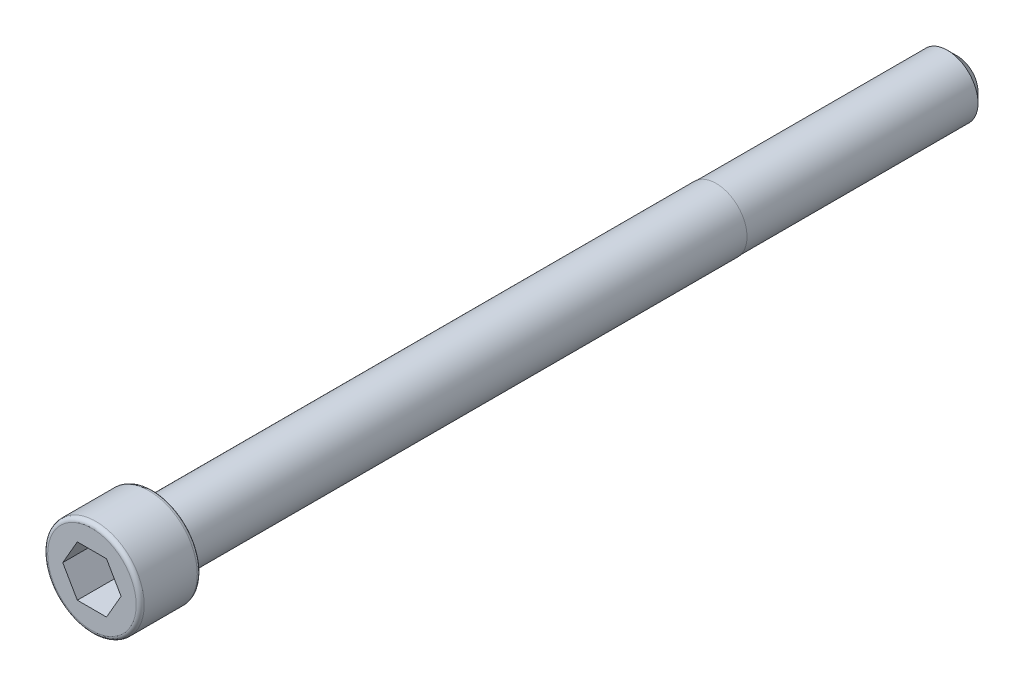
ISO-10303-21;
HEADER;
FILE_DESCRIPTION(('STEP AP214'),'2;1');
FILE_NAME('part.step','',(''),(''),'','','');
FILE_SCHEMA(('AUTOMOTIVE_DESIGN { 1 0 10303 214 1 1 1 1 }'));
ENDSEC;
DATA;
#1=APPLICATION_CONTEXT('core data for automotive mechanical design processes');
#2=APPLICATION_PROTOCOL_DEFINITION('international standard','automotive_design',2000,#1);
#3=PRODUCT_CONTEXT('',#1,'mechanical');
#4=PRODUCT('Part','Part','',(#3));
#5=PRODUCT_RELATED_PRODUCT_CATEGORY('part','',(#4));
#6=PRODUCT_DEFINITION_FORMATION('','',#4);
#7=PRODUCT_DEFINITION_CONTEXT('part definition',#1,'design');
#8=PRODUCT_DEFINITION('design','',#6,#7);
#9=PRODUCT_DEFINITION_SHAPE('','',#8);
#10=(LENGTH_UNIT() NAMED_UNIT(*) SI_UNIT(.MILLI.,.METRE.));
#11=(NAMED_UNIT(*) PLANE_ANGLE_UNIT() SI_UNIT($,.RADIAN.));
#12=(NAMED_UNIT(*) SI_UNIT($,.STERADIAN.) SOLID_ANGLE_UNIT());
#13=UNCERTAINTY_MEASURE_WITH_UNIT(LENGTH_MEASURE(1.E-05),#10,'distance_accuracy_value','');
#14=(GEOMETRIC_REPRESENTATION_CONTEXT(3) GLOBAL_UNCERTAINTY_ASSIGNED_CONTEXT((#13)) GLOBAL_UNIT_ASSIGNED_CONTEXT((#10,
#11,#12)) REPRESENTATION_CONTEXT('',''));
#15=CARTESIAN_POINT('',(0.,0.,0.));
#16=DIRECTION('',(0.,0.,1.));
#17=DIRECTION('',(1.,0.,0.));
#18=AXIS2_PLACEMENT_3D('',#15,#16,#17);
#19=CARTESIAN_POINT('',(0.,0.,1.016));
#20=DIRECTION('',(0.,0.,-1.));
#21=DIRECTION('',(-1.,0.,0.));
#22=AXIS2_PLACEMENT_3D('',#19,#20,#21);
#23=PLANE('',#22);
#24=DIRECTION('',(-0.50000000000019,0.866025403784329,0.));
#25=VECTOR('',#24,1.);
#26=CARTESIAN_POINT('',(1.15117870174,1.9939,1.01599999948));
#27=LINE('',#26,#25);
#28=CARTESIAN_POINT('',(2.30235740349704,-5.5337414309686E-11,1.01599999974));
#29=VERTEX_POINT('',#28);
#30=CARTESIAN_POINT('',(1.1511787015175,1.9939,1.01599999961));
#31=VERTEX_POINT('',#30);
#32=EDGE_CURVE('E85',#29,#31,#27,.T.);
#33=ORIENTED_EDGE('',*,*,#32,.T.);
#34=DIRECTION('',(-1.,0.,0.));
#35=VECTOR('',#34,1.);
#36=CARTESIAN_POINT('',(-1.15117870174,1.9939,1.01599999948));
#37=LINE('',#36,#35);
#38=CARTESIAN_POINT('',(-1.1511787017706,1.99389999994363,1.01599999974));
#39=VERTEX_POINT('',#38);
#40=EDGE_CURVE('E190',#31,#39,#37,.T.);
#41=ORIENTED_EDGE('',*,*,#40,.T.);
#42=DIRECTION('',(-0.50000000000019,-0.866025403784329,0.));
#43=VECTOR('',#42,1.);
#44=CARTESIAN_POINT('',(-2.30235740347,0.,1.01599999948));
#45=LINE('',#44,#43);
#46=CARTESIAN_POINT('',(-2.30235740347708,8.90044598723807E-12,1.01599999974));
#47=VERTEX_POINT('',#46);
#48=EDGE_CURVE('E195',#39,#47,#45,.T.);
#49=ORIENTED_EDGE('',*,*,#48,.T.);
#50=DIRECTION('',(0.50000000000019,-0.866025403784329,0.));
#51=VECTOR('',#50,1.);
#52=CARTESIAN_POINT('',(-1.15117870174,-1.9939,1.01599999948));
#53=LINE('',#52,#51);
#54=CARTESIAN_POINT('',(-1.1511787015175,-1.9939,1.01599999974));
#55=VERTEX_POINT('',#54);
#56=EDGE_CURVE('E199',#47,#55,#53,.T.);
#57=ORIENTED_EDGE('',*,*,#56,.T.);
#58=DIRECTION('',(1.,0.,0.));
#59=VECTOR('',#58,1.);
#60=CARTESIAN_POINT('',(1.15117870174,-1.9939,1.01599999948));
#61=LINE('',#60,#59);
#62=CARTESIAN_POINT('',(1.1511787017706,-1.99389999994363,1.01599999974));
#63=VERTEX_POINT('',#62);
#64=EDGE_CURVE('E81',#55,#63,#61,.T.);
#65=ORIENTED_EDGE('',*,*,#64,.T.);
#66=DIRECTION('',(0.50000000000019,0.866025403784329,0.));
#67=VECTOR('',#66,1.);
#68=CARTESIAN_POINT('',(2.30235740347,0.,1.01599999948));
#69=LINE('',#68,#67);
#70=EDGE_CURVE('E83',#63,#29,#69,.T.);
#71=ORIENTED_EDGE('',*,*,#70,.T.);
#72=EDGE_LOOP('',(#33,#41,#49,#57,#65,#71));
#73=FACE_BOUND('',#72,.T.);
#74=ADVANCED_FACE('F17',(#73),#23,.F.);
#75=CARTESIAN_POINT('',(1.15117870174,1.9939,4.826));
#76=DIRECTION('',(0.866025403784329,0.50000000000019,0.));
#77=DIRECTION('',(-0.50000000000019,0.866025403784329,0.));
#78=AXIS2_PLACEMENT_3D('',#75,#76,#77);
#79=PLANE('',#78);
#80=DIRECTION('',(0.,0.,1.));
#81=VECTOR('',#80,1.);
#82=CARTESIAN_POINT('',(1.15117870085,1.9939,4.826));
#83=LINE('',#82,#81);
#84=CARTESIAN_POINT('',(1.151178701295,1.9938999997975,4.826));
#85=VERTEX_POINT('',#84);
#86=EDGE_CURVE('E96',#85,#31,#83,.F.);
#87=ORIENTED_EDGE('',*,*,#86,.T.);
#88=ORIENTED_EDGE('',*,*,#32,.F.);
#89=DIRECTION('',(0.,0.,1.));
#90=VECTOR('',#89,1.);
#91=CARTESIAN_POINT('',(2.30235740344984,-3.49118533747311E-11,4.826));
#92=LINE('',#91,#90);
#93=CARTESIAN_POINT('',(2.30235740350163,-2.65298030653041E-11,4.826));
#94=VERTEX_POINT('',#93);
#95=EDGE_CURVE('E90',#29,#94,#92,.T.);
#96=ORIENTED_EDGE('',*,*,#95,.T.);
#97=DIRECTION('',(0.500000000469234,-0.866025403513526,0.));
#98=VECTOR('',#97,1.);
#99=CARTESIAN_POINT('',(1.15117870085,1.99389999919,4.826));
#100=LINE('',#99,#98);
#101=EDGE_CURVE('E189',#85,#94,#100,.T.);
#102=ORIENTED_EDGE('',*,*,#101,.F.);
#103=EDGE_LOOP('',(#87,#88,#96,#102));
#104=FACE_BOUND('',#103,.T.);
#105=ADVANCED_FACE('F93',(#104),#79,.F.);
#106=CARTESIAN_POINT('',(2.30235740347,0.,4.826));
#107=DIRECTION('',(0.866025403784329,-0.50000000000019,0.));
#108=DIRECTION('',(0.50000000000019,0.866025403784329,0.));
#109=AXIS2_PLACEMENT_3D('',#106,#107,#108);
#110=PLANE('',#109);
#111=ORIENTED_EDGE('',*,*,#95,.F.);
#112=ORIENTED_EDGE('',*,*,#70,.F.);
#113=DIRECTION('',(0.,0.,-1.));
#114=VECTOR('',#113,1.);
#115=CARTESIAN_POINT('',(1.15117870174,-1.9939,4.826));
#116=LINE('',#115,#114);
#117=CARTESIAN_POINT('',(1.1511787015787,-1.99389999968476,4.826));
#118=VERTEX_POINT('',#117);
#119=EDGE_CURVE('E104',#63,#118,#116,.F.);
#120=ORIENTED_EDGE('',*,*,#119,.T.);
#121=DIRECTION('',(-0.500000000469234,-0.866025403513526,0.));
#122=VECTOR('',#121,1.);
#123=CARTESIAN_POINT('',(2.30235740356,0.,4.826));
#124=LINE('',#123,#122);
#125=EDGE_CURVE('E101',#94,#118,#124,.T.);
#126=ORIENTED_EDGE('',*,*,#125,.F.);
#127=EDGE_LOOP('',(#111,#112,#120,#126));
#128=FACE_BOUND('',#127,.T.);
#129=ADVANCED_FACE('F99',(#128),#110,.F.);
#130=CARTESIAN_POINT('',(1.15117870174,-1.9939,4.826));
#131=DIRECTION('',(0.,-1.,0.));
#132=DIRECTION('',(0.,0.,-1.));
#133=AXIS2_PLACEMENT_3D('',#130,#131,#132);
#134=PLANE('',#133);
#135=ORIENTED_EDGE('',*,*,#119,.F.);
#136=ORIENTED_EDGE('',*,*,#64,.F.);
#137=DIRECTION('',(0.,0.,1.));
#138=VECTOR('',#137,1.);
#139=CARTESIAN_POINT('',(-1.15117870174,-1.9939,4.826));
#140=LINE('',#139,#138);
#141=CARTESIAN_POINT('',(-1.1511787010725,-1.9938999997975,4.826));
#142=VERTEX_POINT('',#141);
#143=EDGE_CURVE('E197',#55,#142,#140,.T.);
#144=ORIENTED_EDGE('',*,*,#143,.T.);
#145=DIRECTION('',(1.,0.,0.));
#146=VECTOR('',#145,1.);
#147=CARTESIAN_POINT('',(0.,-1.99389999919,4.826));
#148=LINE('',#147,#146);
#149=EDGE_CURVE('E203',#118,#142,#148,.F.);
#150=ORIENTED_EDGE('',*,*,#149,.F.);
#151=EDGE_LOOP('',(#135,#136,#144,#150));
#152=FACE_BOUND('',#151,.T.);
#153=ADVANCED_FACE('F204',(#152),#134,.F.);
#154=CARTESIAN_POINT('',(-1.15117870174,-1.9939,4.826));
#155=DIRECTION('',(-0.866025403784329,-0.50000000000019,0.));
#156=DIRECTION('',(0.50000000000019,-0.866025403784329,0.));
#157=AXIS2_PLACEMENT_3D('',#154,#155,#156);
#158=PLANE('',#157);
#159=ORIENTED_EDGE('',*,*,#143,.F.);
#160=ORIENTED_EDGE('',*,*,#56,.F.);
#161=DIRECTION('',(0.,0.,1.));
#162=VECTOR('',#161,1.);
#163=CARTESIAN_POINT('',(-2.30235740347,0.,4.826));
#164=LINE('',#163,#162);
#165=CARTESIAN_POINT('',(-2.30235740350667,1.78016505743743E-11,4.826));
#166=VERTEX_POINT('',#165);
#167=EDGE_CURVE('E193',#47,#166,#164,.T.);
#168=ORIENTED_EDGE('',*,*,#167,.T.);
#169=DIRECTION('',(-0.500000000469234,0.866025403513526,0.));
#170=VECTOR('',#169,1.);
#171=CARTESIAN_POINT('',(-1.15117870085,-1.99389999919,4.826));
#172=LINE('',#171,#170);
#173=EDGE_CURVE('E209',#142,#166,#172,.T.);
#174=ORIENTED_EDGE('',*,*,#173,.F.);
#175=EDGE_LOOP('',(#159,#160,#168,#174));
#176=FACE_BOUND('',#175,.T.);
#177=ADVANCED_FACE('F346',(#176),#158,.F.);
#178=CARTESIAN_POINT('',(-2.30235740347,0.,4.826));
#179=DIRECTION('',(-0.866025403784329,0.50000000000019,0.));
#180=DIRECTION('',(-0.50000000000019,-0.866025403784329,0.));
#181=AXIS2_PLACEMENT_3D('',#178,#179,#180);
#182=PLANE('',#181);
#183=ORIENTED_EDGE('',*,*,#167,.F.);
#184=ORIENTED_EDGE('',*,*,#48,.F.);
#185=DIRECTION('',(0.,0.,1.));
#186=VECTOR('',#185,1.);
#187=CARTESIAN_POINT('',(-1.15117870174,1.9939,4.826));
#188=LINE('',#187,#186);
#189=CARTESIAN_POINT('',(-1.1511787015787,1.99389999968476,4.826));
#190=VERTEX_POINT('',#189);
#191=EDGE_CURVE('E182',#39,#190,#188,.T.);
#192=ORIENTED_EDGE('',*,*,#191,.T.);
#193=DIRECTION('',(0.500000000469234,0.866025403513526,0.));
#194=VECTOR('',#193,1.);
#195=CARTESIAN_POINT('',(-2.30235740356,0.,4.826));
#196=LINE('',#195,#194);
#197=EDGE_CURVE('E217',#166,#190,#196,.T.);
#198=ORIENTED_EDGE('',*,*,#197,.F.);
#199=EDGE_LOOP('',(#183,#184,#192,#198));
#200=FACE_BOUND('',#199,.T.);
#201=ADVANCED_FACE('F337',(#200),#182,.F.);
#202=CARTESIAN_POINT('',(-1.15117870174,1.9939,4.826));
#203=DIRECTION('',(0.,1.,0.));
#204=DIRECTION('',(-1.,0.,0.));
#205=AXIS2_PLACEMENT_3D('',#202,#203,#204);
#206=PLANE('',#205);
#207=ORIENTED_EDGE('',*,*,#191,.F.);
#208=ORIENTED_EDGE('',*,*,#40,.F.);
#209=ORIENTED_EDGE('',*,*,#86,.F.);
#210=DIRECTION('',(1.,0.,0.));
#211=VECTOR('',#210,1.);
#212=CARTESIAN_POINT('',(0.,1.99389999919,4.826));
#213=LINE('',#212,#211);
#214=EDGE_CURVE('E219',#190,#85,#213,.T.);
#215=ORIENTED_EDGE('',*,*,#214,.F.);
#216=EDGE_LOOP('',(#207,#208,#209,#215));
#217=FACE_BOUND('',#216,.T.);
#218=ADVANCED_FACE('F329',(#217),#206,.F.);
#219=CARTESIAN_POINT('',(0.,0.,4.826));
#220=DIRECTION('',(0.,0.,1.));
#221=DIRECTION('',(1.,0.,0.));
#222=AXIS2_PLACEMENT_3D('',#219,#220,#221);
#223=PLANE('',#222);
#224=ORIENTED_EDGE('',*,*,#197,.T.);
#225=ORIENTED_EDGE('',*,*,#214,.T.);
#226=ORIENTED_EDGE('',*,*,#101,.T.);
#227=ORIENTED_EDGE('',*,*,#125,.T.);
#228=ORIENTED_EDGE('',*,*,#149,.T.);
#229=ORIENTED_EDGE('',*,*,#173,.T.);
#230=EDGE_LOOP('',(#224,#225,#226,#227,#228,#229));
#231=FACE_BOUND('',#230,.T.);
#232=CARTESIAN_POINT('',(-3.4925,0.,4.826));
#233=CARTESIAN_POINT('',(-3.49250095130771,0.0537844168487152,4.826));
#234=CARTESIAN_POINT('',(-3.49125761775951,0.107568757519057,4.826));
#235=CARTESIAN_POINT('',(-3.48628921123506,0.215022701121439,4.826));
#236=CARTESIAN_POINT('',(-3.48256413825881,0.268692304053478,4.826));
#237=CARTESIAN_POINT('',(-3.47263908316201,0.375802186797694,4.826));
#238=CARTESIAN_POINT('',(-3.46643910104147,0.429242466609871,4.826));
#239=CARTESIAN_POINT('',(-3.45157775862184,0.535779672729036,4.826));
#240=CARTESIAN_POINT('',(-3.44291639832274,0.588876599036024,4.826));
#241=CARTESIAN_POINT('',(-3.42315070296931,0.69461378291273,4.826));
#242=CARTESIAN_POINT('',(-3.41204636791497,0.747254040482449,4.826));
#243=CARTESIAN_POINT('',(-3.38741844179447,0.851965550919247,4.826));
#244=CARTESIAN_POINT('',(-3.3738948507283,0.904036803786325,4.826));
#245=CARTESIAN_POINT('',(-3.34445726683384,1.00749918186719,4.826));
#246=CARTESIAN_POINT('',(-3.32854327400555,1.05889030708097,4.826));
#247=CARTESIAN_POINT('',(-3.29435884941734,1.16088275869862,4.826));
#248=CARTESIAN_POINT('',(-3.27608841765743,1.21148408510249,4.826));
#249=CARTESIAN_POINT('',(-3.237230104732,1.31178895321478,4.826));
#250=CARTESIAN_POINT('',(-3.21664222356649,1.3614924949232,4.82599999999999));
#251=CARTESIAN_POINT('',(-3.17319294782234,1.45989572410699,4.82600000000001));
#252=CARTESIAN_POINT('',(-3.1503315532437,1.50859541158238,4.82600000000004));
#253=CARTESIAN_POINT('',(-3.10238403687142,1.60488700351675,4.82599999999996));
#254=CARTESIAN_POINT('',(-3.07729791507778,1.65247890797574,4.82599999999984));
#255=CARTESIAN_POINT('',(-3.02495448358711,1.74645337481376,4.82600000000016));
#256=CARTESIAN_POINT('',(-2.99769717389009,1.7928359371928,4.82600000000058));
#257=CARTESIAN_POINT('',(-2.94106951918126,1.88429272050554,4.82599999999942));
#258=CARTESIAN_POINT('',(-2.91169917416945,1.92936694143924,4.82599999999783));
#259=CARTESIAN_POINT('',(-2.85090818589969,2.01811091330256,4.82600000000217));
#260=CARTESIAN_POINT('',(-2.81948754264175,2.06178066423218,4.8260000000081));
#261=CARTESIAN_POINT('',(-2.75466278991072,2.14762227087693,4.8259999999919));
#262=CARTESIAN_POINT('',(-2.72125868043763,2.18979412659206,4.82599999996977));
#263=CARTESIAN_POINT('',(-2.65253910687777,2.27255081088689,4.82600000003023));
#264=CARTESIAN_POINT('',(-2.617223642791,2.3131356394666,4.82600000011282));
#265=CARTESIAN_POINT('',(-2.54475364399531,2.39262843140461,4.82599999988718));
#266=CARTESIAN_POINT('',(-2.50759910928639,2.43153639476292,4.82599999957894));
#267=CARTESIAN_POINT('',(-2.4299983688114,2.50914807795325,4.82600000043815));
#268=CARTESIAN_POINT('',(-2.38947976941706,2.54777942208324,4.82600000166598));
#269=CARTESIAN_POINT('',(-2.30665589072351,2.62307391083209,4.82599999262712));
#270=CARTESIAN_POINT('',(-2.26435068558777,2.65973713700595,4.8259999823609));
#271=CARTESIAN_POINT('',(-2.17804479538508,2.73100537621715,4.82599992632632));
#272=CARTESIAN_POINT('',(-2.13404413888851,2.76561042391229,4.82599988055856));
#273=CARTESIAN_POINT('',(-2.03325103864705,2.84108965556754,4.82599962925022));
#274=CARTESIAN_POINT('',(-1.97601020634548,2.88136888660954,4.82599938663408));
#275=CARTESIAN_POINT('',(-1.88257818325289,2.94298123108615,4.82599887847955));
#276=CARTESIAN_POINT('',(-1.84712757835364,2.96544708998243,4.82599866094539));
#277=CARTESIAN_POINT('',(-1.76346370566161,3.01630246828389,4.82599833968376));
#278=CARTESIAN_POINT('',(-1.71493253146231,3.04417253497762,4.82599829799941));
#279=CARTESIAN_POINT('',(-1.61655986320912,3.09745854598928,4.82599848329036));
#280=CARTESIAN_POINT('',(-1.56671866265542,3.12287503414733,4.82599871020599));
#281=CARTESIAN_POINT('',(-1.46586678690898,3.17124536640506,4.82599928365612));
#282=CARTESIAN_POINT('',(-1.41485645861883,3.19419992981153,4.82599963015555));
#283=CARTESIAN_POINT('',(-1.33749931250131,3.22658718151777,4.82599992786549));
#284=CARTESIAN_POINT('',(-1.31157578972567,3.2370412828093,4.82599999010016));
#285=CARTESIAN_POINT('',(-1.2772632041627,3.25055830679065,4.8260000031626));
#286=CARTESIAN_POINT('',(-1.26894731834262,3.25380956686738,4.82600000098418));
#287=CARTESIAN_POINT('',(-1.2146656238912,3.27480994601131,4.82599999038061));
#288=CARTESIAN_POINT('',(-1.16835778810388,3.29168915331098,4.82599999820428));
#289=CARTESIAN_POINT('',(-1.07241683674523,3.32436299899296,4.82599996617769));
#290=CARTESIAN_POINT('',(-1.02274413658395,3.34004174657353,4.82599992359705));
#291=CARTESIAN_POINT('',(-0.951289144795682,3.36085706533536,4.82599983637465));
#292=CARTESIAN_POINT('',(-0.929767519038414,3.36690366570283,4.82599980677656));
#293=CARTESIAN_POINT('',(-0.856866287607898,3.38662506258691,4.82599970323495));
#294=CARTESIAN_POINT('',(-0.805217483543486,3.39932725822745,4.82599962439687));
#295=CARTESIAN_POINT('',(-0.720379348505821,3.4181172668735,4.82599954001666));
#296=CARTESIAN_POINT('',(-0.687345918214095,3.42492532333591,4.82599951821437));
#297=CARTESIAN_POINT('',(-0.590840922785246,3.44334037191012,4.82599949222412));
#298=CARTESIAN_POINT('',(-0.527115672739877,3.45365363152359,4.82599952229308));
#299=CARTESIAN_POINT('',(-0.411992470266003,3.46899728561382,4.82599961456882));
#300=CARTESIAN_POINT('',(-0.360678327046342,3.47467174548045,4.82599966914441));
#301=CARTESIAN_POINT('',(-0.25784990878366,3.48372060622567,4.82599979023614));
#302=CARTESIAN_POINT('',(-0.206335650973799,3.48709520093009,4.82599985675127));
#303=CARTESIAN_POINT('',(-0.103213441422338,3.49152456415629,4.8259999605506));
#304=CARTESIAN_POINT('',(-0.0516054999186971,3.49257957249508,4.82599999783782));
#305=CARTESIAN_POINT('',(0.0516584692465476,3.49242034582949,4.8260000021644));
#306=CARTESIAN_POINT('',(0.103314491893357,3.4912037804988,4.82599996913162));
#307=CARTESIAN_POINT('',(0.206520575958427,3.48656206845455,4.82599992955414));
#308=CARTESIAN_POINT('',(0.258070652176523,3.48313725471453,4.82599992300544));
#309=CARTESIAN_POINT('',(0.360963284538255,3.47404150508104,4.82599998840567));
#310=CARTESIAN_POINT('',(0.412305859844803,3.46837078162007,4.82600006034719));
#311=CARTESIAN_POINT('',(0.52752154465549,3.45322803075311,4.82599992024647));
#312=CARTESIAN_POINT('',(0.591319714864386,3.44316019603631,4.82599963274455));
#313=CARTESIAN_POINT('',(0.673982986679909,3.42750042438782,4.8259994749533));
#314=CARTESIAN_POINT('',(0.693191005854818,3.42367585666563,4.8259994535447));
#315=CARTESIAN_POINT('',(0.769421263585956,3.40779501994053,4.82599943927506));
#316=CARTESIAN_POINT('',(0.826173978853371,3.39440464367302,4.82599958638948));
#317=CARTESIAN_POINT('',(0.912859131729578,3.37165561679765,4.8259997454351));
#318=CARTESIAN_POINT('',(0.943060260948491,3.3632952526321,4.82599978841998));
#319=CARTESIAN_POINT('',(1.01632006755366,3.34194773639414,4.8259998814082));
#320=CARTESIAN_POINT('',(1.05925454037887,3.32853040078232,4.82599992632526));
#321=CARTESIAN_POINT('',(1.14949236002663,3.29841093680456,4.82599998599283));
#322=CARTESIAN_POINT('',(1.19672903150414,3.28150845586508,4.82599999667072));
#323=CARTESIAN_POINT('',(1.25761380851147,3.25826277697965,4.82599999997576));
#324=CARTESIAN_POINT('',(1.27160947263458,3.25281773275548,4.82600000000801));
#325=CARTESIAN_POINT('',(1.31158681614839,3.23697692237502,4.82599999998507));
#326=CARTESIAN_POINT('',(1.33748353467184,3.22636594035495,4.8259999998303));
#327=CARTESIAN_POINT('',(1.41477977992539,3.19361237270242,4.82600000033892));
#328=CARTESIAN_POINT('',(1.46579162894157,3.17054686828672,4.82600000197498));
#329=CARTESIAN_POINT('',(1.56666006088445,3.12202579604722,4.82599998174152));
#330=CARTESIAN_POINT('',(1.61651669067601,3.09657032539184,4.82599995987296));
#331=CARTESIAN_POINT('',(1.71496405186119,3.04331576420105,4.82599985684906));
#332=CARTESIAN_POINT('',(1.7635547990828,3.01551670298719,4.82599977569446));
#333=CARTESIAN_POINT('',(1.84739066070905,2.96489255510572,4.82599945796473));
#334=CARTESIAN_POINT('',(1.8829356944891,2.94256106325786,4.82599926530915));
#335=CARTESIAN_POINT('',(1.9765914339524,2.88130343457128,4.82599872684066));
#336=CARTESIAN_POINT('',(2.03396174877461,2.84123207858725,4.82599836449067));
#337=CARTESIAN_POINT('',(2.13485451731467,2.76595757309878,4.82599820313271));
#338=CARTESIAN_POINT('',(2.17885060991409,2.73138501053438,4.82599830589885));
#339=CARTESIAN_POINT('',(2.26509575868037,2.66014070559059,4.82599875716389));
#340=CARTESIAN_POINT('',(2.30734528060094,2.62346952914442,4.82599910559682));
#341=CARTESIAN_POINT('',(2.38984528112677,2.54797712363782,4.82599969623092));
#342=CARTESIAN_POINT('',(2.43009643959074,2.50915663542951,4.82599993846845));
#343=CARTESIAN_POINT('',(2.49164876163638,2.44742934528695,4.82600003441541));
#344=CARTESIAN_POINT('',(2.51348396849335,2.42504871797396,4.82600001230034));
#345=CARTESIAN_POINT('',(2.56058421531572,2.37546588621157,4.82599998289972));
#346=CARTESIAN_POINT('',(2.58572565203965,2.34814574446068,4.82599997916758));
#347=CARTESIAN_POINT('',(2.64449509703361,2.28222299055783,4.8259999173366));
#348=CARTESIAN_POINT('',(2.67772913159731,2.24326776144292,4.82599983917353));
#349=CARTESIAN_POINT('',(2.72779810272376,2.18189078206844,4.82599967477469));
#350=CARTESIAN_POINT('',(2.74524667794025,2.15996680181388,4.82599960820816));
#351=CARTESIAN_POINT('',(2.77843919957838,2.11720233635289,4.82599947772255));
#352=CARTESIAN_POINT('',(2.79421848983115,2.09638923315041,4.82599941393018));
#353=CARTESIAN_POINT('',(2.84792623289834,2.02384729204241,4.82599921059709));
#354=CARTESIAN_POINT('',(2.88465797511551,1.97122111118459,4.8259990959785));
#355=CARTESIAN_POINT('',(2.94291571102955,1.882547611883,4.82599905139041));
#356=CARTESIAN_POINT('',(2.96530640225807,1.84706248207531,4.82599907126315));
#357=CARTESIAN_POINT('',(3.01602804174656,1.76334305045665,4.82599915506728));
#358=CARTESIAN_POINT('',(3.04385266706731,1.71480006205868,4.82599923147186));
#359=CARTESIAN_POINT('',(3.09710548595293,1.61642693998906,4.82599943008741));
#360=CARTESIAN_POINT('',(3.12253394870108,1.56659695170133,4.82599955229323));
#361=CARTESIAN_POINT('',(3.17094192420764,1.46576642977521,4.82599978249398));
#362=CARTESIAN_POINT('',(3.19392177518164,1.41476605898224,4.82599989049087));
#363=CARTESIAN_POINT('',(3.22650352904517,1.33747851648301,4.82599998158143));
#364=CARTESIAN_POINT('',(3.23704922161561,1.31158544464938,4.82600000012788));
#365=CARTESIAN_POINT('',(3.25674188929155,1.26153881815315,4.82599999988187));
#366=CARTESIAN_POINT('',(3.26593421054084,1.23740309266108,4.82599998382748));
#367=CARTESIAN_POINT('',(3.29273018731268,1.16471691686096,4.82599993247271));
#368=CARTESIAN_POINT('',(3.30955697638916,1.11587761105143,4.82599989397539));
#369=CARTESIAN_POINT('',(3.34110122715513,1.01753129605817,4.82599987682176));
#370=CARTESIAN_POINT('',(3.35581899244941,0.968024384104684,4.82599989815682));
#371=CARTESIAN_POINT('',(3.38308865041542,0.868422521415378,4.82600000843135));
#372=CARTESIAN_POINT('',(3.39564071308785,0.818327617165065,4.82600009736552));
#373=CARTESIAN_POINT('',(3.41580621871509,0.73024892608776,4.82599986721489));
#374=CARTESIAN_POINT('',(3.42386983017459,0.69236812221093,4.8259996445717));
#375=CARTESIAN_POINT('',(3.43938685080312,0.611838284311693,4.82599945164043));
#376=CARTESIAN_POINT('',(3.44665620973309,0.569153667627369,4.82599951420228));
#377=CARTESIAN_POINT('',(3.46299496757132,0.461165249861801,4.82599967770579));
#378=CARTESIAN_POINT('',(3.4710186367182,0.395702428596684,4.82599978161336));
#379=CARTESIAN_POINT('',(3.48390863994499,0.25824706050607,4.82599993386127));
#380=CARTESIAN_POINT('',(3.4884069401995,0.186219579171003,4.82599997605458));
#381=CARTESIAN_POINT('',(3.49191298711629,0.0760962877146059,4.82600000171917));
#382=CARTESIAN_POINT('',(3.49251065978642,0.0380459559738478,4.82600000351537));
#383=CARTESIAN_POINT('',(3.4925,0.,4.826));
#384=B_SPLINE_CURVE_WITH_KNOTS('',3,(#232,#233,#234,#235,#236,#237,#238,#239,#240,#241,#242,
#243,#244,#245,#246,#247,#248,#249,#250,#251,#252,#253,#254,#255,#256,#257,#258,#259,#260,#261,
#262,#263,#264,#265,#266,#267,#268,#269,#270,#271,#272,#273,#274,#275,#276,#277,#278,#279,#280,
#281,#282,#283,#284,#285,#286,#287,#288,#289,#290,#291,#292,#293,#294,#295,#296,#297,#298,#299,
#300,#301,#302,#303,#304,#305,#306,#307,#308,#309,#310,#311,#312,#313,#314,#315,#316,#317,#318,
#319,#320,#321,#322,#323,#324,#325,#326,#327,#328,#329,#330,#331,#332,#333,#334,#335,#336,#337,
#338,#339,#340,#341,#342,#343,#344,#345,#346,#347,#348,#349,#350,#351,#352,#353,#354,#355,#356,
#357,#358,#359,#360,#361,#362,#363,#364,#365,#366,#367,#368,#369,#370,#371,#372,#373,#374,#375,
#376,#377,#378,#379,#380,#381,#382,#383),.UNSPECIFIED.,.F.,.F.,(4,2,2,2,2,2,2,2,2,2,2,2,2,2,2,2,
2,2,2,2,2,2,2,2,2,2,2,2,2,2,2,2,2,2,2,2,2,2,2,2,2,2,2,2,2,2,2,2,2,2,2,2,2,2,2,2,2,2,2,2,2,2,2,2,
2,2,2,2,2,2,2,2,2,2,2,4),(0.,0.161338773196214,0.322677546392428,0.484016319588641,
0.645355092784855,0.806693865981066,0.968032639177283,1.12937141237349,1.2907101855697,
1.45204895876591,1.61338773196213,1.77472650515834,1.93606527835455,2.09740405155076,
2.25874282474698,2.42008159794319,2.5814203711394,2.74275914433562,2.91064582905079,
3.07852555148779,3.2464024461871,3.45623976108323,3.58212596054041,3.74994361335377,
3.91772398325986,4.08545519803693,4.16930509495521,4.19609180361308,4.34391069810973,
4.50011737746179,4.56718016633308,4.72667375031603,4.82784713502767,5.02139415195395,
5.1762279614621,5.33104872042004,5.48585347204145,5.64081711958778,5.79575740620599,
5.9506830410802,6.14432430244255,6.20307816119164,6.37791614863079,6.47191931601119,
6.60683087432195,6.75728875018523,6.80234079591049,6.88629257089911,7.0541762141514,
7.22205303474194,7.3899277552734,7.51584043337318,7.72562576591714,7.89342821579159,
8.06118562568246,8.2288855665257,8.32268236815574,8.43404738495866,8.58760966087114,
8.67166169774053,8.75001225213626,8.942424111921,9.06827816233932,9.2360633051767,
9.40382957661751,9.57157264514684,9.65544030801214,9.73291597011632,9.8878352726082,
10.0427322512188,10.1976170653763,10.3137827020191,10.4436451868486,10.6413982260157,
10.8577547641024,10.9718980038413),.UNSPECIFIED.);
#385=CARTESIAN_POINT('',(-3.4925,0.,4.826));
#386=VERTEX_POINT('',#385);
#387=CARTESIAN_POINT('',(3.4925,0.,4.826));
#388=VERTEX_POINT('',#387);
#389=EDGE_CURVE('E221',#386,#388,#384,.T.);
#390=ORIENTED_EDGE('',*,*,#389,.F.);
#391=CARTESIAN_POINT('',(0.,0.,4.826));
#392=DIRECTION('',(0.,0.,-1.));
#393=DIRECTION('',(1.,0.,0.));
#394=AXIS2_PLACEMENT_3D('',#391,#392,#393);
#395=CIRCLE('',#394,3.4925);
#396=EDGE_CURVE('E120',#388,#386,#395,.T.);
#397=ORIENTED_EDGE('',*,*,#396,.F.);
#398=EDGE_LOOP('',(#390,#397));
#399=FACE_BOUND('',#398,.T.);
#400=ADVANCED_FACE('F170',(#231,#399),#223,.T.);
#401=CARTESIAN_POINT('',(0.,0.,4.5085));
#402=DIRECTION('',(0.,0.,1.));
#403=DIRECTION('',(-1.,0.,0.));
#404=AXIS2_PLACEMENT_3D('',#401,#402,#403);
#405=TOROIDAL_SURFACE('',#404,3.4925,0.3175);
#406=ORIENTED_EDGE('',*,*,#389,.T.);
#407=ORIENTED_EDGE('',*,*,#396,.T.);
#408=EDGE_LOOP('',(#406,#407));
#409=FACE_BOUND('',#408,.T.);
#410=CARTESIAN_POINT('',(0.,0.,4.5085));
#411=DIRECTION('',(0.,0.,1.));
#412=DIRECTION('',(1.,0.,0.));
#413=AXIS2_PLACEMENT_3D('',#410,#411,#412);
#414=CIRCLE('',#413,3.81);
#415=CARTESIAN_POINT('',(3.81,0.,4.5085));
#416=VERTEX_POINT('',#415);
#417=EDGE_CURVE('E118',#416,#416,#414,.F.);
#418=ORIENTED_EDGE('',*,*,#417,.F.);
#419=EDGE_LOOP('',(#418));
#420=FACE_BOUND('',#419,.T.);
#421=ADVANCED_FACE('F164',(#409,#420),#405,.T.);
#422=CARTESIAN_POINT('',(0.,0.,-63.5));
#423=DIRECTION('',(0.,0.,1.));
#424=DIRECTION('',(1.,0.,0.));
#425=AXIS2_PLACEMENT_3D('',#422,#423,#424);
#426=PLANE('',#425);
#427=CARTESIAN_POINT('',(0.,0.,-63.4999999999764));
#428=DIRECTION('',(0.,0.,1.));
#429=DIRECTION('',(1.,0.,0.));
#430=AXIS2_PLACEMENT_3D('',#427,#428,#429);
#431=CIRCLE('',#430,1.61925000003293);
#432=CARTESIAN_POINT('',(1.61925000003293,0.,-63.4999999999764));
#433=VERTEX_POINT('',#432);
#434=EDGE_CURVE('E114',#433,#433,#431,.T.);
#435=ORIENTED_EDGE('',*,*,#434,.F.);
#436=EDGE_LOOP('',(#435));
#437=FACE_BOUND('',#436,.T.);
#438=ADVANCED_FACE('F169',(#437),#426,.F.);
#439=CARTESIAN_POINT('',(0.,0.,0.));
#440=DIRECTION('',(0.,0.,1.));
#441=DIRECTION('',(1.,0.,0.));
#442=AXIS2_PLACEMENT_3D('',#439,#440,#441);
#443=CYLINDRICAL_SURFACE('',#442,3.81);
#444=CARTESIAN_POINT('',(0.,0.,0.3175));
#445=DIRECTION('',(0.,0.,-1.));
#446=DIRECTION('',(1.,0.,0.));
#447=AXIS2_PLACEMENT_3D('',#444,#445,#446);
#448=CIRCLE('',#447,3.81);
#449=CARTESIAN_POINT('',(3.81,0.,0.3175));
#450=VERTEX_POINT('',#449);
#451=EDGE_CURVE('E117',#450,#450,#448,.T.);
#452=ORIENTED_EDGE('',*,*,#451,.F.);
#453=EDGE_LOOP('',(#452));
#454=FACE_BOUND('',#453,.T.);
#455=ORIENTED_EDGE('',*,*,#417,.T.);
#456=EDGE_LOOP('',(#455));
#457=FACE_BOUND('',#456,.T.);
#458=ADVANCED_FACE('F241',(#454,#457),#443,.T.);
#459=CARTESIAN_POINT('',(0.,0.,-62.7062500000193));
#460=DIRECTION('',(0.,0.,1.));
#461=DIRECTION('',(1.,0.,0.));
#462=AXIS2_PLACEMENT_3D('',#459,#460,#461);
#463=CONICAL_SURFACE('',#462,2.41299999999001,0.785398163397448);
#464=ORIENTED_EDGE('',*,*,#434,.T.);
#465=EDGE_LOOP('',(#464));
#466=FACE_BOUND('',#465,.T.);
#467=CARTESIAN_POINT('',(0.,0.,-62.70625));
#468=DIRECTION('',(0.,0.,-1.));
#469=DIRECTION('',(-1.,0.,0.));
#470=AXIS2_PLACEMENT_3D('',#467,#468,#469);
#471=CIRCLE('',#470,2.413);
#472=CARTESIAN_POINT('',(-2.413,0.,-62.70625));
#473=VERTEX_POINT('',#472);
#474=EDGE_CURVE('E151',#473,#473,#471,.F.);
#475=ORIENTED_EDGE('',*,*,#474,.F.);
#476=EDGE_LOOP('',(#475));
#477=FACE_BOUND('',#476,.T.);
#478=ADVANCED_FACE('F137',(#466,#477),#463,.T.);
#479=CARTESIAN_POINT('',(0.,0.,0.3175));
#480=DIRECTION('',(0.,0.,-1.));
#481=DIRECTION('',(1.,0.,0.));
#482=AXIS2_PLACEMENT_3D('',#479,#480,#481);
#483=TOROIDAL_SURFACE('',#482,3.4925,0.3175);
#484=CARTESIAN_POINT('',(3.4925,0.,0.));
#485=CARTESIAN_POINT('',(3.49250103075493,0.0548554386916498,-2.09812721195199E-13));
#486=CARTESIAN_POINT('',(3.49120764772346,0.109710792244904,-1.04906360597541E-13));
#487=CARTESIAN_POINT('',(3.48603944896599,0.219299772455741,1.04906360597425E-13));
#488=CARTESIAN_POINT('',(3.48216463323997,0.274033399113323,2.09812721194734E-13));
#489=CARTESIAN_POINT('',(3.47184096397162,0.38325736891393,-2.0981272119427E-13));
#490=CARTESIAN_POINT('',(3.46539211042928,0.437747712056957,-7.34344524179189E-13));
#491=CARTESIAN_POINT('',(3.44993498429349,0.546364157857678,7.34344524176749E-13));
#492=CARTESIAN_POINT('',(3.44092671170005,0.600490260515374,2.72756537550924E-12));
#493=CARTESIAN_POINT('',(3.4203707388517,0.708258108800809,-2.72756537549717E-12));
#494=CARTESIAN_POINT('',(3.4088230385968,0.761899854428551,-1.01759169777943E-11));
#495=CARTESIAN_POINT('',(3.38321356500163,0.868579760294865,1.01759169777379E-11));
#496=CARTESIAN_POINT('',(3.36915179166137,0.921617920533441,3.79761025353721E-11));
#497=CARTESIAN_POINT('',(3.33854651242355,1.02697348338672,-3.79761025351197E-11));
#498=CARTESIAN_POINT('',(3.32200300652601,1.07929088600142,-1.41728493162371E-10));
#499=CARTESIAN_POINT('',(3.28646676572368,1.18308668341869,1.41728493161274E-10));
#500=CARTESIAN_POINT('',(3.26747403081892,1.23456507822127,5.28937870108367E-10));
#501=CARTESIAN_POINT('',(3.22541745396728,1.34082045482438,-5.72948748511526E-10));
#502=CARTESIAN_POINT('',(3.2021463625928,1.39551550091629,-2.22084562319813E-09));
#503=CARTESIAN_POINT('',(3.15287878853342,1.50366075549216,9.49381791557917E-09));
#504=CARTESIAN_POINT('',(3.12688242180297,1.55711101682079,2.28557399291724E-08));
#505=CARTESIAN_POINT('',(3.07222056347815,1.66262777855654,9.35158103919374E-08));
#506=CARTESIAN_POINT('',(3.04355511120479,1.71469429933443,1.50813311671165E-07));
#507=CARTESIAN_POINT('',(2.98364649559711,1.81732359491237,4.38322660083501E-07));
#508=CARTESIAN_POINT('',(2.95240329858408,1.86788635005371,6.68536766721361E-07));
#509=CARTESIAN_POINT('',(2.88731266508974,1.96740101426567,1.19374841235256E-06));
#510=CARTESIAN_POINT('',(2.85346199900374,2.01635081486648,1.48882715869826E-06));
#511=CARTESIAN_POINT('',(2.78321214803887,2.11237051076023,1.72107549948544E-06));
#512=CARTESIAN_POINT('',(2.74681343356572,2.15944075054002,1.65831098563617E-06));
#513=CARTESIAN_POINT('',(2.67163607112966,2.25162499157862,1.25411535370921E-06));
#514=CARTESIAN_POINT('',(2.63285805436322,2.29673950629133,9.1275784948221E-07));
#515=CARTESIAN_POINT('',(2.55286110507995,2.38471426950349,3.18021853745481E-07));
#516=CARTESIAN_POINT('',(2.51164301724777,2.42757528851098,6.46131228867418E-08));
#517=CARTESIAN_POINT('',(2.44394080492616,2.49515288699991,-3.93607941022556E-08));
#518=CARTESIAN_POINT('',(2.4179940765682,2.52041401840283,-8.66029867831067E-09));
#519=CARTESIAN_POINT('',(2.36102417534515,2.57412633214442,4.82657407062441E-08));
#520=CARTESIAN_POINT('',(2.32986081596326,2.6024294745211,7.29552303127642E-08));
#521=CARTESIAN_POINT('',(2.25451194153974,2.66844420238837,1.91889056723857E-07));
#522=CARTESIAN_POINT('',(2.20987699968704,2.70564515393594,3.08994323382234E-07));
#523=CARTESIAN_POINT('',(2.14313816343163,2.75848553184766,5.12363674342908E-07));
#524=CARTESIAN_POINT('',(2.12174036496883,2.77502368788578,5.81667128580306E-07));
#525=CARTESIAN_POINT('',(2.07919461111888,2.80711077881713,7.04231723975026E-07));
#526=CARTESIAN_POINT('',(2.05805780756925,2.82267450192175,7.57904627636369E-07));
#527=CARTESIAN_POINT('',(1.99605832778206,2.8672407237802,8.8753592984081E-07));
#528=CARTESIAN_POINT('',(1.95472916081823,2.89559954679039,9.39405405238572E-07));
#529=CARTESIAN_POINT('',(1.88632380091935,2.94035339969148,9.19698387625334E-07));
#530=CARTESIAN_POINT('',(1.85960913091512,2.95730531688262,8.86576478827475E-07));
#531=CARTESIAN_POINT('',(1.797101354671,2.99577634463936,7.89758794509634E-07));
#532=CARTESIAN_POINT('',(1.76113866808308,3.01702113008824,7.19671138718183E-07));
#533=CARTESIAN_POINT('',(1.68847866036188,3.05820925357641,5.95879160836578E-07));
#534=CARTESIAN_POINT('',(1.65178135844715,3.07815262560448,5.42174410742365E-07));
#535=CARTESIAN_POINT('',(1.56287832492531,3.12441990635484,4.19388844197404E-07));
#536=CARTESIAN_POINT('',(1.51033917078923,3.15010620949775,3.52747136023275E-07));
#537=CARTESIAN_POINT('',(1.40403880893236,3.19880768732667,2.36102506013171E-07));
#538=CARTESIAN_POINT('',(1.35027764804138,3.22182296416619,1.86098947713861E-07));
#539=CARTESIAN_POINT('',(1.26494643959612,3.25584488022635,1.20813628602225E-07));
#540=CARTESIAN_POINT('',(1.23373986665508,3.2677709594701,9.9835238085077E-08));
#541=CARTESIAN_POINT('',(1.17099679363046,3.29072145371812,6.31551609781029E-08));
#542=CARTESIAN_POINT('',(1.13946030106618,3.30174588922178,4.74533543968587E-08));
#543=CARTESIAN_POINT('',(1.0780683630411,3.32222821426819,2.49734234976062E-08));
#544=CARTESIAN_POINT('',(1.04823116837516,3.33174095926145,1.76985141514646E-08));
#545=CARTESIAN_POINT('',(0.977912907439797,3.35313045473455,5.93085087732378E-09));
#546=CARTESIAN_POINT('',(0.937332332767593,3.36468156937523,3.28044057419767E-09));
#547=CARTESIAN_POINT('',(0.849897804705737,3.38787218695534,7.97689071999967E-11));
#548=CARTESIAN_POINT('',(0.8029834035227,3.39928403347575,-1.12351814785254E-10));
#549=CARTESIAN_POINT('',(0.702780246115235,3.42147508310594,2.43993847320562E-10));
#550=CARTESIAN_POINT('',(0.649433526363574,3.43199314621677,8.88881076769856E-10));
#551=CARTESIAN_POINT('',(0.536310196737131,3.45157085839791,1.82824961820272E-09));
#552=CARTESIAN_POINT('',(0.476482364798151,3.46033540321774,2.07541892809898E-09));
#553=CARTESIAN_POINT('',(0.350409845881685,3.4754782172931,1.96495096700549E-09));
#554=CARTESIAN_POINT('',(0.284125549393371,3.48152739714214,1.54391670913986E-09));
#555=CARTESIAN_POINT('',(0.145241440006662,3.49021435389499,5.6534597914781E-10));
#556=CARTESIAN_POINT('',(0.0726185238759296,3.49248948380003,-1.15357763984597E-12));
#557=CARTESIAN_POINT('',(-0.0571477966275232,3.4925082752815,9.07818237514806E-13));
#558=CARTESIAN_POINT('',(-0.114292873112433,3.4911140655033,3.53365705774095E-10));
#559=CARTESIAN_POINT('',(-0.228447696524996,3.48552239267027,1.63698339353776E-09));
#560=CARTESIAN_POINT('',(-0.285457442507398,3.48132491009274,2.56814722401659E-09));
#561=CARTESIAN_POINT('',(-0.399202190423771,3.47013721091142,4.88797221515167E-09));
#562=CARTESIAN_POINT('',(-0.4559371905695,3.46314697615506,6.27663634949783E-09));
#563=CARTESIAN_POINT('',(-0.568996218357445,3.44639046815173,9.39990877489304E-09));
#564=CARTESIAN_POINT('',(-0.625320243517101,3.43662417814978,1.11345191538957E-08));
#565=CARTESIAN_POINT('',(-0.737421405438348,3.41433909921506,1.48460490595284E-08));
#566=CARTESIAN_POINT('',(-0.793198539151283,3.40182029494746,1.68229699360943E-08));
#567=CARTESIAN_POINT('',(-0.90407150074711,3.3740603246738,2.09238686597391E-08));
#568=CARTESIAN_POINT('',(-0.959167325149088,3.35881914476484,2.30478472577931E-08));
#569=CARTESIAN_POINT('',(-1.06854484352431,3.32565113623645,2.7355867281821E-08));
#570=CARTESIAN_POINT('',(-1.12282653371656,3.30772429514857,2.95399089866055E-08));
#571=CARTESIAN_POINT('',(-1.23044493394711,3.269228151012,3.38893528359306E-08));
#572=CARTESIAN_POINT('',(-1.2837816400359,3.24865883692223,3.60547549025485E-08));
#573=CARTESIAN_POINT('',(-1.38938149637478,3.2049273067841,4.02964996972785E-08));
#574=CARTESIAN_POINT('',(-1.44164464263677,3.18176508110558,4.23728420945797E-08));
#575=CARTESIAN_POINT('',(-1.5449713922897,3.13290354056719,4.63743327674135E-08));
#576=CARTESIAN_POINT('',(-1.59603499178171,3.10720421746234,4.82994805515613E-08));
#577=CARTESIAN_POINT('',(-1.69683955227386,3.05333041329519,5.19447317748585E-08));
#578=CARTESIAN_POINT('',(-1.74658050958926,3.02515592533829,5.36648346428206E-08));
#579=CARTESIAN_POINT('',(-1.84461987880532,2.96639969171059,5.68544304450678E-08));
#580=CARTESIAN_POINT('',(-1.89291828735708,2.9358179404519,5.83239227975952E-08));
#581=CARTESIAN_POINT('',(-1.98795613001143,2.87232088574002,6.09750163873022E-08));
#582=CARTESIAN_POINT('',(-2.03469556121873,2.83940557795338,6.21566170898457E-08));
#583=CARTESIAN_POINT('',(-2.12650277894502,2.77132074320259,6.42029310761364E-08));
#584=CARTESIAN_POINT('',(-2.17157056313566,2.73615121309885,6.50676439185227E-08));
#585=CARTESIAN_POINT('',(-2.25992584719314,2.66364270287518,6.64594702553944E-08));
#586=CARTESIAN_POINT('',(-2.3032133454069,2.6263037207409,6.69865834364084E-08));
#587=CARTESIAN_POINT('',(-2.38790371056897,2.54954630728724,6.76907833166857E-08));
#588=CARTESIAN_POINT('',(-2.4293065766423,2.51012787500246,6.78678698534438E-08));
#589=CARTESIAN_POINT('',(-2.51012787500508,2.42930657664858,6.78678739718611E-08));
#590=CARTESIAN_POINT('',(-2.54954630729452,2.38790371057948,6.76907915535193E-08));
#591=CARTESIAN_POINT('',(-2.62630372075794,2.3032133454254,6.69865997025401E-08));
#592=CARTESIAN_POINT('',(-2.66364270289731,2.25992584721538,6.6459490432406E-08));
#593=CARTESIAN_POINT('',(-2.73615121313147,2.17157056316494,6.50676718800801E-08));
#594=CARTESIAN_POINT('',(-2.77132074324061,2.1265027789776,6.42029629113577E-08));
#595=CARTESIAN_POINT('',(-2.83940557800274,2.03469556125717,6.2156656269856E-08));
#596=CARTESIAN_POINT('',(-2.87232088579532,1.98795613005243,6.09750590384363E-08));
#597=CARTESIAN_POINT('',(-2.93581794051863,1.89291828740344,5.83239720867919E-08));
#598=CARTESIAN_POINT('',(-2.9663996917828,1.84461987885445,5.68544829012022E-08));
#599=CARTESIAN_POINT('',(-3.02515592542452,1.7465805096405,5.36648928837125E-08));
#600=CARTESIAN_POINT('',(-3.05333041338996,1.69683955232442,5.194479263357E-08));
#601=CARTESIAN_POINT('',(-3.10720421756392,1.59603499184111,4.82995461108066E-08));
#602=CARTESIAN_POINT('',(-3.13290354066703,1.54497139235861,4.63744004093732E-08));
#603=CARTESIAN_POINT('',(-3.18176508124126,1.44164464268383,4.23729132304814E-08));
#604=CARTESIAN_POINT('',(-3.20492730695736,1.38938149639046,4.02965722444093E-08));
#605=CARTESIAN_POINT('',(-3.24865883702467,1.28378164013854,3.60548294816371E-08));
#606=CARTESIAN_POINT('',(-3.26922815100606,1.23044493416808,3.38894280357503E-08));
#607=CARTESIAN_POINT('',(-3.30772429547112,1.12282653361253,2.95399847077151E-08));
#608=CARTESIAN_POINT('',(-3.32565113699587,1.06854484297693,2.73559429034923E-08));
#609=CARTESIAN_POINT('',(-3.35881914436339,0.95916732580822,2.30479210391736E-08));
#610=CARTESIAN_POINT('',(-3.3740603226746,0.904071503056076,2.09239407002751E-08));
#611=CARTESIAN_POINT('',(-3.40182029734616,0.793198536945062,1.68230401428768E-08));
#612=CARTESIAN_POINT('',(-3.41433910760934,0.737421397067143,1.48461191733944E-08));
#613=CARTESIAN_POINT('',(-3.43662417019649,0.625320251978097,1.11345777348495E-08));
#614=CARTESIAN_POINT('',(-3.44639043785545,0.568996249815461,9.39995591591556E-09));
#615=CARTESIAN_POINT('',(-3.46314700693315,0.455937159184739,6.27669752022137E-09));
#616=CARTESIAN_POINT('',(-3.47013732510623,0.399202073199869,4.88805885528663E-09));
#617=CARTESIAN_POINT('',(-3.48132479642105,0.28545755978296,2.56814103197817E-09));
#618=CARTESIAN_POINT('',(-3.48552196771792,0.228448134136523,1.63685890085153E-09));
#619=CARTESIAN_POINT('',(-3.4911144910145,0.114292435531898,3.53534758143927E-10));
#620=CARTESIAN_POINT('',(-3.49250986252664,0.0571461635295168,1.48871262229743E-12));
#621=CARTESIAN_POINT('',(-3.4925,0.,0.));
#622=B_SPLINE_CURVE_WITH_KNOTS('',3,(#484,#485,#486,#487,#488,#489,#490,#491,#492,#493,#494,
#495,#496,#497,#498,#499,#500,#501,#502,#503,#504,#505,#506,#507,#508,#509,#510,#511,#512,#513,
#514,#515,#516,#517,#518,#519,#520,#521,#522,#523,#524,#525,#526,#527,#528,#529,#530,#531,#532,
#533,#534,#535,#536,#537,#538,#539,#540,#541,#542,#543,#544,#545,#546,#547,#548,#549,#550,#551,
#552,#553,#554,#555,#556,#557,#558,#559,#560,#561,#562,#563,#564,#565,#566,#567,#568,#569,#570,
#571,#572,#573,#574,#575,#576,#577,#578,#579,#580,#581,#582,#583,#584,#585,#586,#587,#588,#589,
#590,#591,#592,#593,#594,#595,#596,#597,#598,#599,#600,#601,#602,#603,#604,#605,#606,#607,#608,
#609,#610,#611,#612,#613,#614,#615,#616,#617,#618,#619,#620,#621),.UNSPECIFIED.,.F.,.F.,(4,2,2,
2,2,2,2,2,2,2,2,2,2,2,2,2,2,2,2,2,2,2,2,2,2,2,2,2,2,2,2,2,2,2,2,2,2,2,2,2,2,2,2,2,2,2,2,2,2,2,2,
2,2,2,2,2,2,2,2,2,2,2,2,2,2,2,2,2,4),(0.,0.16455094894471,0.329101897889238,0.493652846833402,
0.658203795777019,0.822754744719907,0.987305693661884,1.15185664260277,1.31640759154238,
1.49465018975532,1.67288520721433,1.85111759932659,2.02935232044561,2.20781146661454,
2.38623775315006,2.56461690858187,2.74293467116416,2.8515616562749,2.97782691711684,
3.15206116972734,3.23318677616948,3.31192714313035,3.46223992829283,3.55714795654417,
3.6824258086431,3.80770038757283,3.98307014927988,4.15843320175183,4.25864467708661,
4.35885387342213,4.45279437888963,4.57934388821619,4.72415011912115,4.88721235241544,
5.06853000097921,5.2681026100976,5.48592985764223,5.65735095763431,5.82877325145884,
6.000196659527,6.17162110225,6.34304650003902,6.51447277330525,6.68589984245988,
6.85732762791411,7.02875605007913,7.20018502936614,7.37161448618635,7.54304434095096,
7.71447451407119,7.88590492595823,8.05733549702332,8.22876614767766,8.40019679833247,
8.57162736939896,8.74305778128836,8.91448795441188,9.08591780918073,9.25734726600612,
9.42877624529925,9.60020466747134,9.77163245293357,9.94305952209714,10.1144857953733,
10.2859111931731,10.4573356359079,10.6287590439888,10.8001813378269,10.9716024378336),.UNSPECIFIED.);
#623=CARTESIAN_POINT('',(3.4925,0.,0.));
#624=VERTEX_POINT('',#623);
#625=CARTESIAN_POINT('',(-3.4925,0.,0.));
#626=VERTEX_POINT('',#625);
#627=EDGE_CURVE('E36',#624,#626,#622,.T.);
#628=ORIENTED_EDGE('',*,*,#627,.T.);
#629=CARTESIAN_POINT('',(0.,0.,0.));
#630=DIRECTION('',(0.,0.,1.));
#631=DIRECTION('',(-1.,0.,0.));
#632=AXIS2_PLACEMENT_3D('',#629,#630,#631);
#633=CIRCLE('',#632,3.4925);
#634=EDGE_CURVE('E113',#626,#624,#633,.T.);
#635=ORIENTED_EDGE('',*,*,#634,.T.);
#636=EDGE_LOOP('',(#628,#635));
#637=FACE_BOUND('',#636,.T.);
#638=ORIENTED_EDGE('',*,*,#451,.T.);
#639=EDGE_LOOP('',(#638));
#640=FACE_BOUND('',#639,.T.);
#641=ADVANCED_FACE('F125',(#637,#640),#483,.T.);
#642=CARTESIAN_POINT('',(0.,0.,0.));
#643=DIRECTION('',(0.,0.,-1.));
#644=DIRECTION('',(-1.,0.,0.));
#645=AXIS2_PLACEMENT_3D('',#642,#643,#644);
#646=CYLINDRICAL_SURFACE('',#645,2.413);
#647=ORIENTED_EDGE('',*,*,#474,.T.);
#648=EDGE_LOOP('',(#647));
#649=FACE_BOUND('',#648,.T.);
#650=CARTESIAN_POINT('',(0.,0.,-44.4499999993));
#651=DIRECTION('',(0.,0.,-1.));
#652=DIRECTION('',(-1.,0.,0.));
#653=AXIS2_PLACEMENT_3D('',#650,#651,#652);
#654=CIRCLE('',#653,2.413);
#655=CARTESIAN_POINT('',(-2.413,0.,-44.4499999993));
#656=VERTEX_POINT('',#655);
#657=EDGE_CURVE('E110',#656,#656,#654,.T.);
#658=ORIENTED_EDGE('',*,*,#657,.T.);
#659=EDGE_LOOP('',(#658));
#660=FACE_BOUND('',#659,.T.);
#661=ADVANCED_FACE('F136',(#649,#660),#646,.T.);
#662=CARTESIAN_POINT('',(0.,0.,0.));
#663=DIRECTION('',(0.,0.,1.));
#664=DIRECTION('',(1.,0.,0.));
#665=AXIS2_PLACEMENT_3D('',#662,#663,#664);
#666=PLANE('',#665);
#667=CARTESIAN_POINT('',(0.,0.,0.));
#668=DIRECTION('',(0.,0.,-1.));
#669=DIRECTION('',(-1.,0.,0.));
#670=AXIS2_PLACEMENT_3D('',#667,#668,#669);
#671=CIRCLE('',#670,2.4384);
#672=CARTESIAN_POINT('',(-2.4384,0.,0.));
#673=VERTEX_POINT('',#672);
#674=EDGE_CURVE('E28',#673,#673,#671,.T.);
#675=ORIENTED_EDGE('',*,*,#674,.F.);
#676=EDGE_LOOP('',(#675));
#677=FACE_BOUND('',#676,.T.);
#678=ORIENTED_EDGE('',*,*,#627,.F.);
#679=ORIENTED_EDGE('',*,*,#634,.F.);
#680=EDGE_LOOP('',(#678,#679));
#681=FACE_BOUND('',#680,.T.);
#682=ADVANCED_FACE('F260',(#677,#681),#666,.F.);
#683=CARTESIAN_POINT('',(0.,0.,-44.45));
#684=DIRECTION('',(0.,0.,1.));
#685=DIRECTION('',(1.,0.,0.));
#686=AXIS2_PLACEMENT_3D('',#683,#684,#685);
#687=PLANE('',#686);
#688=ORIENTED_EDGE('',*,*,#657,.F.);
#689=EDGE_LOOP('',(#688));
#690=FACE_BOUND('',#689,.T.);
#691=CARTESIAN_POINT('',(0.,0.,-44.4499999993));
#692=DIRECTION('',(0.,0.,-1.));
#693=DIRECTION('',(-1.,0.,0.));
#694=AXIS2_PLACEMENT_3D('',#691,#692,#693);
#695=CIRCLE('',#694,2.4384);
#696=CARTESIAN_POINT('',(-2.4384,0.,-44.4499999993));
#697=VERTEX_POINT('',#696);
#698=EDGE_CURVE('E11',#697,#697,#695,.F.);
#699=ORIENTED_EDGE('',*,*,#698,.F.);
#700=EDGE_LOOP('',(#699));
#701=FACE_BOUND('',#700,.T.);
#702=ADVANCED_FACE('F254',(#690,#701),#687,.F.);
#703=CARTESIAN_POINT('',(0.,0.,0.));
#704=DIRECTION('',(0.,0.,-1.));
#705=DIRECTION('',(-1.,0.,0.));
#706=AXIS2_PLACEMENT_3D('',#703,#704,#705);
#707=CYLINDRICAL_SURFACE('',#706,2.4384);
#708=ORIENTED_EDGE('',*,*,#674,.T.);
#709=EDGE_LOOP('',(#708));
#710=FACE_BOUND('',#709,.T.);
#711=ORIENTED_EDGE('',*,*,#698,.T.);
#712=EDGE_LOOP('',(#711));
#713=FACE_BOUND('',#712,.T.);
#714=ADVANCED_FACE('F252',(#710,#713),#707,.T.);
#715=CLOSED_SHELL('',(#74,#105,#129,#153,#177,#201,#218,#400,#421,#438,#458,#478,#641,#661,#682,
#702,#714));
#716=MANIFOLD_SOLID_BREP('B1',#715);
#717=ADVANCED_BREP_SHAPE_REPRESENTATION('',(#18,#716),#14);
#718=SHAPE_DEFINITION_REPRESENTATION(#9,#717);
ENDSEC;
END-ISO-10303-21;
